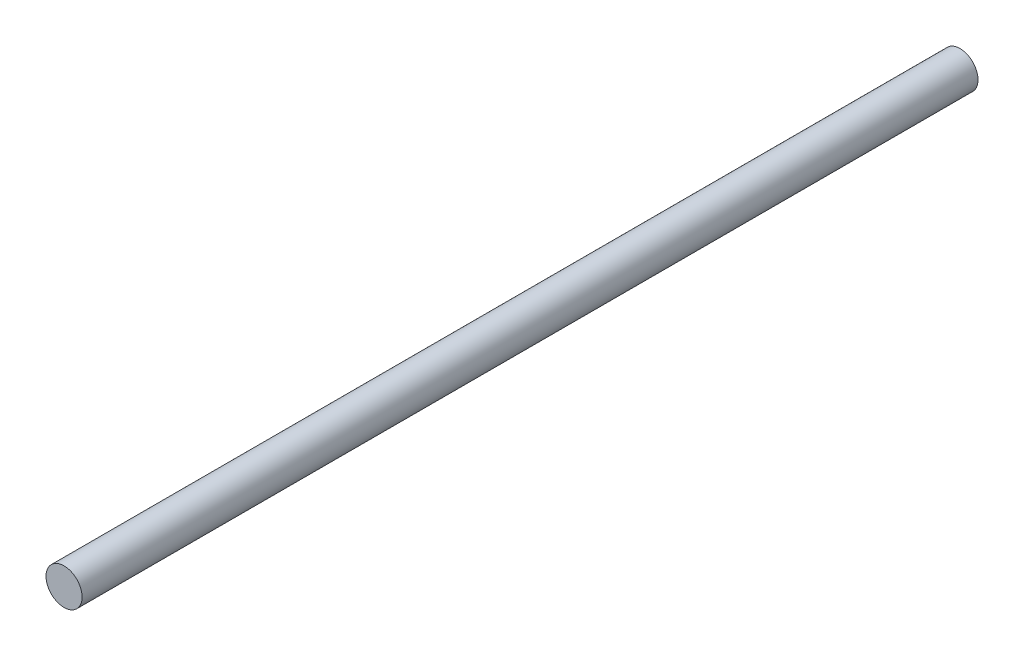
ISO-10303-21;
HEADER;
FILE_DESCRIPTION(('STEP AP214'),'2;1');
FILE_NAME('part.step','',(''),(''),'','','');
FILE_SCHEMA(('AUTOMOTIVE_DESIGN { 1 0 10303 214 1 1 1 1 }'));
ENDSEC;
DATA;
#1=APPLICATION_CONTEXT('core data for automotive mechanical design processes');
#2=APPLICATION_PROTOCOL_DEFINITION('international standard','automotive_design',2000,#1);
#3=PRODUCT_CONTEXT('',#1,'mechanical');
#4=PRODUCT('Part','Part','',(#3));
#5=PRODUCT_RELATED_PRODUCT_CATEGORY('part','',(#4));
#6=PRODUCT_DEFINITION_FORMATION('','',#4);
#7=PRODUCT_DEFINITION_CONTEXT('part definition',#1,'design');
#8=PRODUCT_DEFINITION('design','',#6,#7);
#9=PRODUCT_DEFINITION_SHAPE('','',#8);
#10=(LENGTH_UNIT() NAMED_UNIT(*) SI_UNIT(.MILLI.,.METRE.));
#11=(NAMED_UNIT(*) PLANE_ANGLE_UNIT() SI_UNIT($,.RADIAN.));
#12=(NAMED_UNIT(*) SI_UNIT($,.STERADIAN.) SOLID_ANGLE_UNIT());
#13=UNCERTAINTY_MEASURE_WITH_UNIT(LENGTH_MEASURE(1.E-05),#10,'distance_accuracy_value','');
#14=(GEOMETRIC_REPRESENTATION_CONTEXT(3) GLOBAL_UNCERTAINTY_ASSIGNED_CONTEXT((#13)) GLOBAL_UNIT_ASSIGNED_CONTEXT((#10,
#11,#12)) REPRESENTATION_CONTEXT('',''));
#15=CARTESIAN_POINT('',(0.,0.,0.));
#16=DIRECTION('',(0.,0.,1.));
#17=DIRECTION('',(1.,0.,0.));
#18=AXIS2_PLACEMENT_3D('',#15,#16,#17);
#19=CARTESIAN_POINT('',(0.,0.,118.25));
#20=DIRECTION('',(0.,0.,-1.));
#21=DIRECTION('',(-1.,0.,0.));
#22=AXIS2_PLACEMENT_3D('',#19,#20,#21);
#23=CYLINDRICAL_SURFACE('',#22,4.7625);
#24=CARTESIAN_POINT('',(0.,0.,118.25));
#25=DIRECTION('',(0.,0.,1.));
#26=DIRECTION('',(1.,0.,0.));
#27=AXIS2_PLACEMENT_3D('',#24,#25,#26);
#28=CIRCLE('',#27,4.7625);
#29=CARTESIAN_POINT('',(-4.7625,0.,118.25));
#30=VERTEX_POINT('',#29);
#31=EDGE_CURVE('E10',#30,#30,#28,.T.);
#32=CARTESIAN_POINT('',(0.,0.,-118.25));
#33=DIRECTION('',(0.,0.,1.));
#34=DIRECTION('',(1.,0.,0.));
#35=AXIS2_PLACEMENT_3D('',#32,#33,#34);
#36=CIRCLE('',#35,4.7625);
#37=CARTESIAN_POINT('',(-4.7625,0.,-118.25));
#38=VERTEX_POINT('',#37);
#39=EDGE_CURVE('E39',#38,#38,#36,.T.);
#40=CARTESIAN_POINT('',(-4.7625,0.,118.25));
#41=CARTESIAN_POINT('',(-4.7625,0.,115.786458333333));
#42=CARTESIAN_POINT('',(-4.7625,0.,113.322916666667));
#43=CARTESIAN_POINT('',(-4.7625,0.,108.395833333333));
#44=CARTESIAN_POINT('',(-4.7625,0.,105.932291666667));
#45=CARTESIAN_POINT('',(-4.7625,0.,101.005208333333));
#46=CARTESIAN_POINT('',(-4.7625,0.,98.5416666666667));
#47=CARTESIAN_POINT('',(-4.7625,0.,93.6145833333333));
#48=CARTESIAN_POINT('',(-4.7625,0.,91.1510416666667));
#49=CARTESIAN_POINT('',(-4.7625,0.,86.2239583333333));
#50=CARTESIAN_POINT('',(-4.7625,0.,83.7604166666667));
#51=CARTESIAN_POINT('',(-4.7625,0.,78.8333333333333));
#52=CARTESIAN_POINT('',(-4.7625,0.,76.3697916666666));
#53=CARTESIAN_POINT('',(-4.7625,0.,71.4427083333333));
#54=CARTESIAN_POINT('',(-4.7625,0.,68.9791666666666));
#55=CARTESIAN_POINT('',(-4.7625,0.,64.0520833333333));
#56=CARTESIAN_POINT('',(-4.7625,0.,61.5885416666667));
#57=CARTESIAN_POINT('',(-4.7625,0.,56.6614583333333));
#58=CARTESIAN_POINT('',(-4.7625,0.,54.1979166666667));
#59=CARTESIAN_POINT('',(-4.7625,0.,49.2708333333333));
#60=CARTESIAN_POINT('',(-4.7625,0.,46.8072916666667));
#61=CARTESIAN_POINT('',(-4.7625,0.,41.8802083333333));
#62=CARTESIAN_POINT('',(-4.7625,0.,39.4166666666667));
#63=CARTESIAN_POINT('',(-4.7625,0.,34.4895833333333));
#64=CARTESIAN_POINT('',(-4.7625,0.,32.0260416666667));
#65=CARTESIAN_POINT('',(-4.7625,0.,27.0989583333333));
#66=CARTESIAN_POINT('',(-4.7625,0.,24.6354166666667));
#67=CARTESIAN_POINT('',(-4.7625,0.,19.7083333333333));
#68=CARTESIAN_POINT('',(-4.7625,0.,17.2447916666667));
#69=CARTESIAN_POINT('',(-4.7625,0.,12.3177083333333));
#70=CARTESIAN_POINT('',(-4.7625,0.,9.85416666666665));
#71=CARTESIAN_POINT('',(-4.7625,0.,4.92708333333332));
#72=CARTESIAN_POINT('',(-4.7625,0.,2.46354166666665));
#73=CARTESIAN_POINT('',(-4.7625,0.,-2.46354166666668));
#74=CARTESIAN_POINT('',(-4.7625,0.,-4.92708333333335));
#75=CARTESIAN_POINT('',(-4.7625,0.,-9.85416666666667));
#76=CARTESIAN_POINT('',(-4.7625,0.,-12.3177083333333));
#77=CARTESIAN_POINT('',(-4.7625,0.,-17.2447916666667));
#78=CARTESIAN_POINT('',(-4.7625,0.,-19.7083333333333));
#79=CARTESIAN_POINT('',(-4.7625,0.,-24.6354166666667));
#80=CARTESIAN_POINT('',(-4.7625,0.,-27.0989583333333));
#81=CARTESIAN_POINT('',(-4.7625,0.,-32.0260416666667));
#82=CARTESIAN_POINT('',(-4.7625,0.,-34.4895833333333));
#83=CARTESIAN_POINT('',(-4.7625,0.,-39.4166666666667));
#84=CARTESIAN_POINT('',(-4.7625,0.,-41.8802083333333));
#85=CARTESIAN_POINT('',(-4.7625,0.,-46.8072916666667));
#86=CARTESIAN_POINT('',(-4.7625,0.,-49.2708333333333));
#87=CARTESIAN_POINT('',(-4.7625,0.,-54.1979166666667));
#88=CARTESIAN_POINT('',(-4.7625,0.,-56.6614583333333));
#89=CARTESIAN_POINT('',(-4.7625,0.,-61.5885416666667));
#90=CARTESIAN_POINT('',(-4.7625,0.,-64.0520833333334));
#91=CARTESIAN_POINT('',(-4.7625,0.,-68.9791666666667));
#92=CARTESIAN_POINT('',(-4.7625,0.,-71.4427083333333));
#93=CARTESIAN_POINT('',(-4.7625,0.,-76.3697916666667));
#94=CARTESIAN_POINT('',(-4.7625,0.,-78.8333333333334));
#95=CARTESIAN_POINT('',(-4.7625,0.,-83.7604166666667));
#96=CARTESIAN_POINT('',(-4.7625,0.,-86.2239583333334));
#97=CARTESIAN_POINT('',(-4.7625,0.,-91.1510416666667));
#98=CARTESIAN_POINT('',(-4.7625,0.,-93.6145833333333));
#99=CARTESIAN_POINT('',(-4.7625,0.,-98.5416666666667));
#100=CARTESIAN_POINT('',(-4.7625,0.,-101.005208333333));
#101=CARTESIAN_POINT('',(-4.7625,0.,-105.932291666667));
#102=CARTESIAN_POINT('',(-4.7625,0.,-108.395833333333));
#103=CARTESIAN_POINT('',(-4.7625,0.,-113.322916666667));
#104=CARTESIAN_POINT('',(-4.7625,0.,-115.786458333333));
#105=CARTESIAN_POINT('',(-4.7625,0.,-118.25));
#106=B_SPLINE_CURVE_WITH_KNOTS('',3,(#40,#41,#42,#43,#44,#45,#46,#47,#48,#49,#50,#51,#52,#53,
#54,#55,#56,#57,#58,#59,#60,#61,#62,#63,#64,#65,#66,#67,#68,#69,#70,#71,#72,#73,#74,#75,#76,#77,
#78,#79,#80,#81,#82,#83,#84,#85,#86,#87,#88,#89,#90,#91,#92,#93,#94,#95,#96,#97,#98,#99,#100,
#101,#102,#103,#104,#105),.UNSPECIFIED.,.F.,.F.,(4,2,2,2,2,2,2,2,2,2,2,2,2,2,2,2,2,2,2,2,2,2,2,
2,2,2,2,2,2,2,2,2,4),(0.,7.39062500000001,14.78125,22.171875,29.5625,36.953125,44.34375,
51.734375,59.125,66.515625,73.90625,81.296875,88.6875,96.078125,103.46875,110.859375,118.25,
125.640625,133.03125,140.421875,147.8125,155.203125,162.59375,169.984375,177.375,184.765625,
192.15625,199.546875,206.9375,214.328125,221.71875,229.109375,236.5),.UNSPECIFIED.);
#107=EDGE_CURVE('BSEAM36',#30,#38,#106,.T.);
#108=ORIENTED_EDGE('',*,*,#31,.F.);
#109=ORIENTED_EDGE('',*,*,#39,.T.);
#110=ORIENTED_EDGE('',*,*,#107,.T.);
#111=ORIENTED_EDGE('',*,*,#107,.F.);
#112=EDGE_LOOP('',(#108,#110,#109,#111));
#113=FACE_BOUND('',#112,.T.);
#114=ADVANCED_FACE('F36',(#113),#23,.T.);
#115=CARTESIAN_POINT('',(0.,0.,118.25));
#116=DIRECTION('',(0.,0.,1.));
#117=DIRECTION('',(1.,0.,0.));
#118=AXIS2_PLACEMENT_3D('',#115,#116,#117);
#119=PLANE('',#118);
#120=ORIENTED_EDGE('',*,*,#31,.T.);
#121=EDGE_LOOP('',(#120));
#122=FACE_BOUND('',#121,.T.);
#123=ADVANCED_FACE('F51',(#122),#119,.T.);
#124=CARTESIAN_POINT('',(0.,0.,-118.25));
#125=DIRECTION('',(0.,0.,1.));
#126=DIRECTION('',(1.,0.,0.));
#127=AXIS2_PLACEMENT_3D('',#124,#125,#126);
#128=PLANE('',#127);
#129=ORIENTED_EDGE('',*,*,#39,.F.);
#130=EDGE_LOOP('',(#129));
#131=FACE_BOUND('',#130,.T.);
#132=ADVANCED_FACE('F49',(#131),#128,.F.);
#133=CLOSED_SHELL('',(#114,#123,#132));
#134=MANIFOLD_SOLID_BREP('B2',#133);
#135=ADVANCED_BREP_SHAPE_REPRESENTATION('',(#18,#134),#14);
#136=SHAPE_DEFINITION_REPRESENTATION(#9,#135);
ENDSEC;
END-ISO-10303-21;
